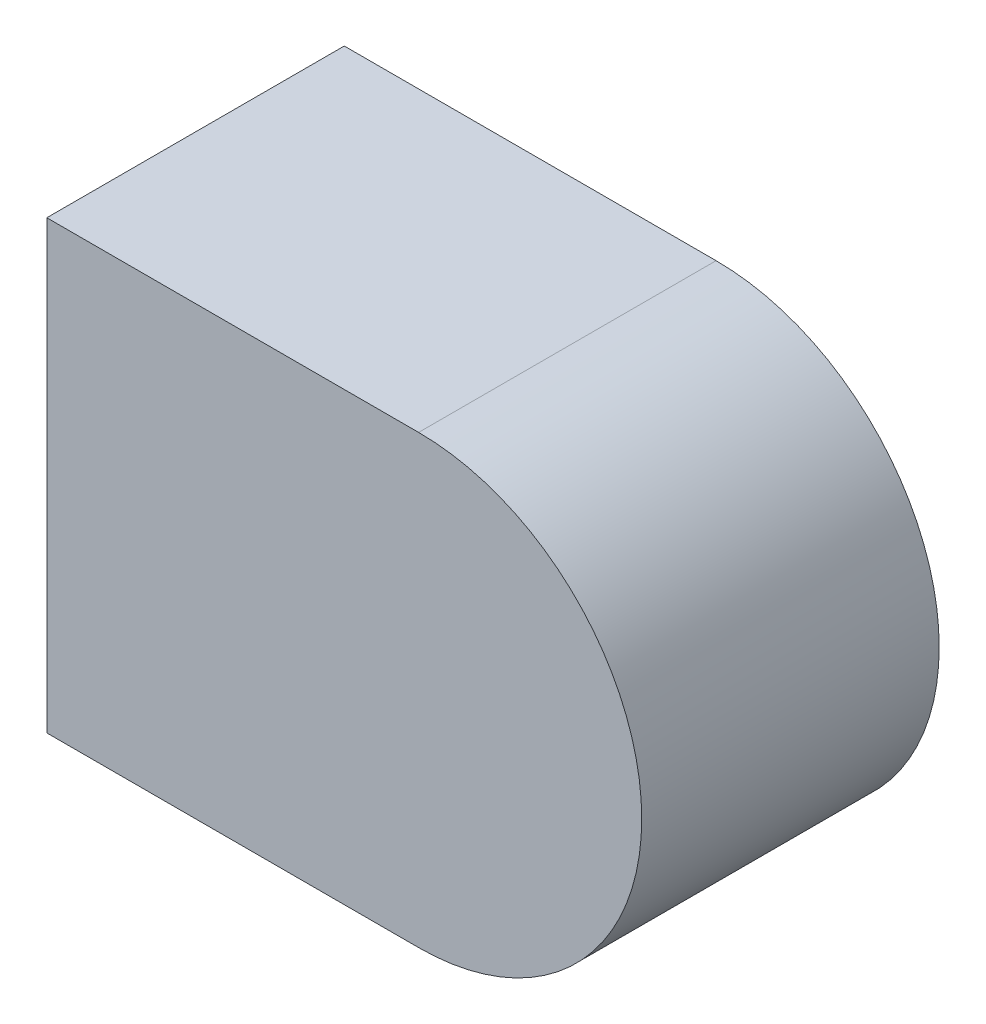
ISO-10303-21;
HEADER;
FILE_DESCRIPTION(('STEP AP214'),'2;1');
FILE_NAME('part.step','',(''),(''),'','','');
FILE_SCHEMA(('AUTOMOTIVE_DESIGN { 1 0 10303 214 1 1 1 1 }'));
ENDSEC;
DATA;
#1=APPLICATION_CONTEXT('core data for automotive mechanical design processes');
#2=APPLICATION_PROTOCOL_DEFINITION('international standard','automotive_design',2000,#1);
#3=PRODUCT_CONTEXT('',#1,'mechanical');
#4=PRODUCT('Part','Part','',(#3));
#5=PRODUCT_RELATED_PRODUCT_CATEGORY('part','',(#4));
#6=PRODUCT_DEFINITION_FORMATION('','',#4);
#7=PRODUCT_DEFINITION_CONTEXT('part definition',#1,'design');
#8=PRODUCT_DEFINITION('design','',#6,#7);
#9=PRODUCT_DEFINITION_SHAPE('','',#8);
#10=(LENGTH_UNIT() NAMED_UNIT(*) SI_UNIT(.MILLI.,.METRE.));
#11=(NAMED_UNIT(*) PLANE_ANGLE_UNIT() SI_UNIT($,.RADIAN.));
#12=(NAMED_UNIT(*) SI_UNIT($,.STERADIAN.) SOLID_ANGLE_UNIT());
#13=UNCERTAINTY_MEASURE_WITH_UNIT(LENGTH_MEASURE(1.E-05),#10,'distance_accuracy_value','');
#14=(GEOMETRIC_REPRESENTATION_CONTEXT(3) GLOBAL_UNCERTAINTY_ASSIGNED_CONTEXT((#13)) GLOBAL_UNIT_ASSIGNED_CONTEXT((#10,
#11,#12)) REPRESENTATION_CONTEXT('',''));
#15=CARTESIAN_POINT('',(0.,0.,0.));
#16=DIRECTION('',(0.,0.,1.));
#17=DIRECTION('',(1.,0.,0.));
#18=AXIS2_PLACEMENT_3D('',#15,#16,#17);
#19=CARTESIAN_POINT('',(-1.8,0.475,0.2));
#20=DIRECTION('',(0.,1.,0.));
#21=DIRECTION('',(1.,0.,0.));
#22=AXIS2_PLACEMENT_3D('',#19,#20,#21);
#23=PLANE('',#22);
#24=DIRECTION('',(1.,0.,0.));
#25=VECTOR('',#24,1.);
#26=CARTESIAN_POINT('',(-1.8,0.475,0.2));
#27=LINE('',#26,#25);
#28=CARTESIAN_POINT('',(-2.,0.475,0.2));
#29=VERTEX_POINT('',#28);
#30=CARTESIAN_POINT('',(-1.75,0.475,0.2));
#31=VERTEX_POINT('',#30);
#32=EDGE_CURVE('E11',#29,#31,#27,.T.);
#33=ORIENTED_EDGE('',*,*,#32,.T.);
#34=DIRECTION('',(0.,0.,-1.));
#35=VECTOR('',#34,1.);
#36=CARTESIAN_POINT('',(-1.75,0.475,0.2));
#37=LINE('',#36,#35);
#38=CARTESIAN_POINT('',(-1.75,0.475,0.));
#39=VERTEX_POINT('',#38);
#40=EDGE_CURVE('E28',#31,#39,#37,.T.);
#41=ORIENTED_EDGE('',*,*,#40,.T.);
#42=DIRECTION('',(1.,0.,0.));
#43=VECTOR('',#42,1.);
#44=CARTESIAN_POINT('',(-1.8,0.475,0.));
#45=LINE('',#44,#43);
#46=CARTESIAN_POINT('',(-2.,0.475,0.));
#47=VERTEX_POINT('',#46);
#48=EDGE_CURVE('E119',#47,#39,#45,.T.);
#49=ORIENTED_EDGE('',*,*,#48,.F.);
#50=DIRECTION('',(0.,0.,-1.));
#51=VECTOR('',#50,1.);
#52=CARTESIAN_POINT('',(-2.,0.475,0.2));
#53=LINE('',#52,#51);
#54=EDGE_CURVE('E94',#29,#47,#53,.T.);
#55=ORIENTED_EDGE('',*,*,#54,.F.);
#56=EDGE_LOOP('',(#33,#41,#49,#55));
#57=FACE_BOUND('',#56,.T.);
#58=ADVANCED_FACE('F17',(#57),#23,.T.);
#59=CARTESIAN_POINT('',(-2.,0.325,0.2));
#60=DIRECTION('',(1.,0.,0.));
#61=DIRECTION('',(0.,1.,0.));
#62=AXIS2_PLACEMENT_3D('',#59,#60,#61);
#63=PLANE('',#62);
#64=DIRECTION('',(0.,-1.,0.));
#65=VECTOR('',#64,1.);
#66=CARTESIAN_POINT('',(-2.,0.325,0.));
#67=LINE('',#66,#65);
#68=CARTESIAN_POINT('',(-2.,0.175,0.));
#69=VERTEX_POINT('',#68);
#70=EDGE_CURVE('E97',#47,#69,#67,.T.);
#71=ORIENTED_EDGE('',*,*,#70,.T.);
#72=DIRECTION('',(0.,0.,-1.));
#73=VECTOR('',#72,1.);
#74=CARTESIAN_POINT('',(-2.,0.175,0.2));
#75=LINE('',#74,#73);
#76=CARTESIAN_POINT('',(-2.,0.175,0.2));
#77=VERTEX_POINT('',#76);
#78=EDGE_CURVE('E76',#77,#69,#75,.T.);
#79=ORIENTED_EDGE('',*,*,#78,.F.);
#80=DIRECTION('',(0.,-1.,0.));
#81=VECTOR('',#80,1.);
#82=CARTESIAN_POINT('',(-2.,0.325,0.2));
#83=LINE('',#82,#81);
#84=EDGE_CURVE('E72',#29,#77,#83,.T.);
#85=ORIENTED_EDGE('',*,*,#84,.F.);
#86=ORIENTED_EDGE('',*,*,#54,.T.);
#87=EDGE_LOOP('',(#71,#79,#85,#86));
#88=FACE_BOUND('',#87,.T.);
#89=ADVANCED_FACE('F107',(#88),#63,.F.);
#90=CARTESIAN_POINT('',(-1.8,0.175,0.2));
#91=DIRECTION('',(0.,1.,0.));
#92=DIRECTION('',(1.,0.,0.));
#93=AXIS2_PLACEMENT_3D('',#90,#91,#92);
#94=PLANE('',#93);
#95=DIRECTION('',(1.,0.,0.));
#96=VECTOR('',#95,1.);
#97=CARTESIAN_POINT('',(-1.8,0.175,0.));
#98=LINE('',#97,#96);
#99=CARTESIAN_POINT('',(-1.75,0.175,0.));
#100=VERTEX_POINT('',#99);
#101=EDGE_CURVE('E80',#69,#100,#98,.T.);
#102=ORIENTED_EDGE('',*,*,#101,.T.);
#103=DIRECTION('',(0.,0.,1.));
#104=VECTOR('',#103,1.);
#105=CARTESIAN_POINT('',(-1.75,0.175,0.2));
#106=LINE('',#105,#104);
#107=CARTESIAN_POINT('',(-1.75,0.175,0.2));
#108=VERTEX_POINT('',#107);
#109=EDGE_CURVE('E78',#100,#108,#106,.T.);
#110=ORIENTED_EDGE('',*,*,#109,.T.);
#111=DIRECTION('',(1.,0.,0.));
#112=VECTOR('',#111,1.);
#113=CARTESIAN_POINT('',(-1.8,0.175,0.2));
#114=LINE('',#113,#112);
#115=EDGE_CURVE('E21',#77,#108,#114,.T.);
#116=ORIENTED_EDGE('',*,*,#115,.F.);
#117=ORIENTED_EDGE('',*,*,#78,.T.);
#118=EDGE_LOOP('',(#102,#110,#116,#117));
#119=FACE_BOUND('',#118,.T.);
#120=ADVANCED_FACE('F19',(#119),#94,.F.);
#121=CARTESIAN_POINT('',(-0.3375,0.,0.2));
#122=DIRECTION('',(0.,0.,1.));
#123=DIRECTION('',(1.,0.,0.));
#124=AXIS2_PLACEMENT_3D('',#121,#122,#123);
#125=PLANE('',#124);
#126=ORIENTED_EDGE('',*,*,#115,.T.);
#127=CARTESIAN_POINT('',(-1.75,0.325,0.2));
#128=DIRECTION('',(0.,0.,1.));
#129=DIRECTION('',(1.,0.,0.));
#130=AXIS2_PLACEMENT_3D('',#127,#128,#129);
#131=CIRCLE('',#130,0.15);
#132=EDGE_CURVE('E70',#108,#31,#131,.T.);
#133=ORIENTED_EDGE('',*,*,#132,.T.);
#134=ORIENTED_EDGE('',*,*,#32,.F.);
#135=ORIENTED_EDGE('',*,*,#84,.T.);
#136=EDGE_LOOP('',(#126,#133,#134,#135));
#137=FACE_BOUND('',#136,.T.);
#138=ADVANCED_FACE('F68',(#137),#125,.T.);
#139=CARTESIAN_POINT('',(-0.3375,0.,0.));
#140=DIRECTION('',(0.,0.,1.));
#141=DIRECTION('',(1.,0.,0.));
#142=AXIS2_PLACEMENT_3D('',#139,#140,#141);
#143=PLANE('',#142);
#144=CARTESIAN_POINT('',(-1.75,0.325,0.));
#145=DIRECTION('',(0.,0.,-1.));
#146=DIRECTION('',(1.,0.,0.));
#147=AXIS2_PLACEMENT_3D('',#144,#145,#146);
#148=CIRCLE('',#147,0.15);
#149=EDGE_CURVE('E90',#39,#100,#148,.T.);
#150=ORIENTED_EDGE('',*,*,#149,.T.);
#151=ORIENTED_EDGE('',*,*,#101,.F.);
#152=ORIENTED_EDGE('',*,*,#70,.F.);
#153=ORIENTED_EDGE('',*,*,#48,.T.);
#154=EDGE_LOOP('',(#150,#151,#152,#153));
#155=FACE_BOUND('',#154,.T.);
#156=ADVANCED_FACE('F110',(#155),#143,.F.);
#157=CARTESIAN_POINT('',(-1.75,0.325,0.2));
#158=DIRECTION('',(0.,0.,-1.));
#159=DIRECTION('',(1.,0.,0.));
#160=AXIS2_PLACEMENT_3D('',#157,#158,#159);
#161=CYLINDRICAL_SURFACE('',#160,0.15);
#162=ORIENTED_EDGE('',*,*,#40,.F.);
#163=ORIENTED_EDGE('',*,*,#132,.F.);
#164=ORIENTED_EDGE('',*,*,#109,.F.);
#165=ORIENTED_EDGE('',*,*,#149,.F.);
#166=EDGE_LOOP('',(#162,#163,#164,#165));
#167=FACE_BOUND('',#166,.T.);
#168=ADVANCED_FACE('F83',(#167),#161,.T.);
#169=CLOSED_SHELL('',(#58,#89,#120,#138,#156,#168));
#170=MANIFOLD_SOLID_BREP('B1',#169);
#171=ADVANCED_BREP_SHAPE_REPRESENTATION('',(#18,#170),#14);
#172=SHAPE_DEFINITION_REPRESENTATION(#9,#171);
ENDSEC;
END-ISO-10303-21;
